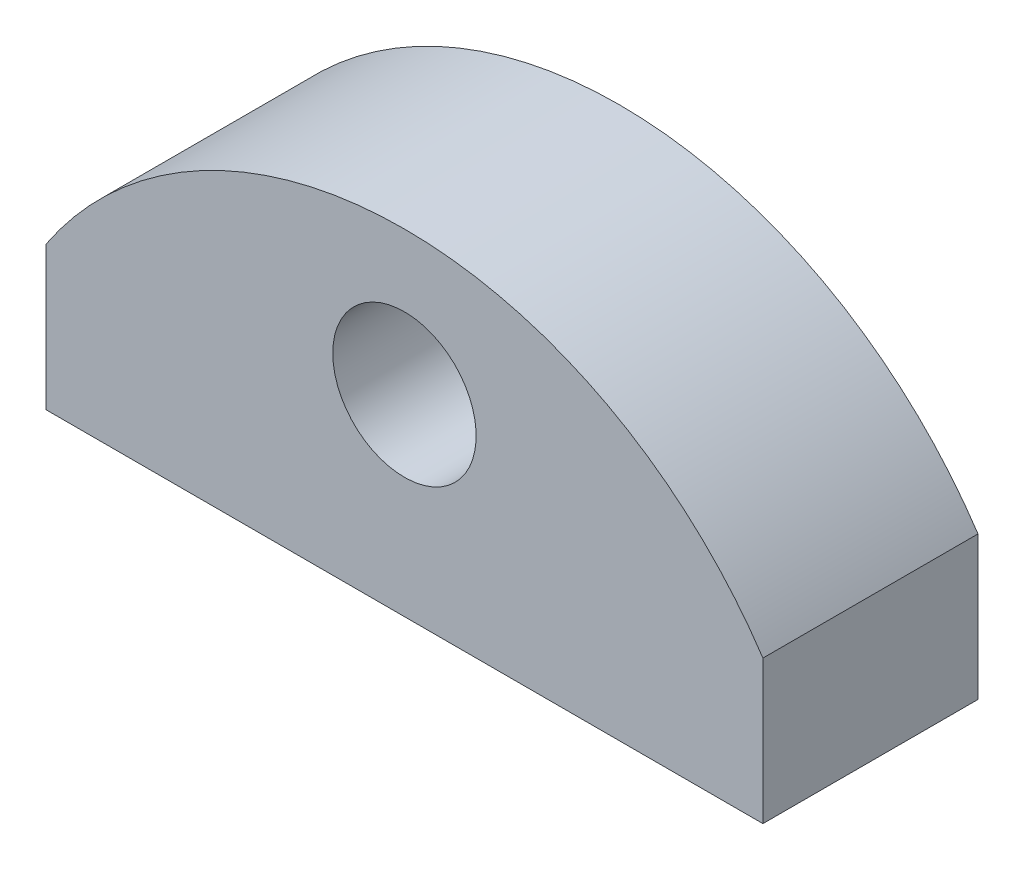
ISO-10303-21;
HEADER;
FILE_DESCRIPTION(('STEP AP214'),'2;1');
FILE_NAME('part.step','',(''),(''),'','','');
FILE_SCHEMA(('AUTOMOTIVE_DESIGN { 1 0 10303 214 1 1 1 1 }'));
ENDSEC;
DATA;
#1=APPLICATION_CONTEXT('core data for automotive mechanical design processes');
#2=APPLICATION_PROTOCOL_DEFINITION('international standard','automotive_design',2000,#1);
#3=PRODUCT_CONTEXT('',#1,'mechanical');
#4=PRODUCT('Part','Part','',(#3));
#5=PRODUCT_RELATED_PRODUCT_CATEGORY('part','',(#4));
#6=PRODUCT_DEFINITION_FORMATION('','',#4);
#7=PRODUCT_DEFINITION_CONTEXT('part definition',#1,'design');
#8=PRODUCT_DEFINITION('design','',#6,#7);
#9=PRODUCT_DEFINITION_SHAPE('','',#8);
#10=(LENGTH_UNIT() NAMED_UNIT(*) SI_UNIT(.MILLI.,.METRE.));
#11=(NAMED_UNIT(*) PLANE_ANGLE_UNIT() SI_UNIT($,.RADIAN.));
#12=(NAMED_UNIT(*) SI_UNIT($,.STERADIAN.) SOLID_ANGLE_UNIT());
#13=UNCERTAINTY_MEASURE_WITH_UNIT(LENGTH_MEASURE(1.E-05),#10,'distance_accuracy_value','');
#14=(GEOMETRIC_REPRESENTATION_CONTEXT(3) GLOBAL_UNCERTAINTY_ASSIGNED_CONTEXT((#13)) GLOBAL_UNIT_ASSIGNED_CONTEXT((#10,
#11,#12)) REPRESENTATION_CONTEXT('',''));
#15=CARTESIAN_POINT('',(0.,0.,0.));
#16=DIRECTION('',(0.,0.,1.));
#17=DIRECTION('',(1.,0.,0.));
#18=AXIS2_PLACEMENT_3D('',#15,#16,#17);
#19=CARTESIAN_POINT('',(0.,-16.583123951777,15.));
#20=DIRECTION('',(0.,0.,-1.));
#21=DIRECTION('',(-1.,0.,0.));
#22=AXIS2_PLACEMENT_3D('',#19,#20,#21);
#23=CYLINDRICAL_SURFACE('',#22,30.);
#24=CARTESIAN_POINT('',(0.,-16.583123951777,0.));
#25=DIRECTION('',(0.,0.,1.));
#26=DIRECTION('',(-1.,0.,0.));
#27=AXIS2_PLACEMENT_3D('',#24,#25,#26);
#28=CIRCLE('',#27,30.);
#29=CARTESIAN_POINT('',(25.,0.,0.));
#30=VERTEX_POINT('',#29);
#31=CARTESIAN_POINT('',(-25.,0.,0.));
#32=VERTEX_POINT('',#31);
#33=EDGE_CURVE('E100',#30,#32,#28,.T.);
#34=ORIENTED_EDGE('',*,*,#33,.T.);
#35=DIRECTION('',(0.,0.,-1.));
#36=VECTOR('',#35,1.);
#37=CARTESIAN_POINT('',(-25.,0.,15.));
#38=LINE('',#37,#36);
#39=CARTESIAN_POINT('',(-25.,0.,15.));
#40=VERTEX_POINT('',#39);
#41=EDGE_CURVE('E11',#40,#32,#38,.T.);
#42=ORIENTED_EDGE('',*,*,#41,.F.);
#43=CARTESIAN_POINT('',(0.,-16.583123951777,15.));
#44=DIRECTION('',(0.,0.,1.));
#45=DIRECTION('',(-1.,0.,0.));
#46=AXIS2_PLACEMENT_3D('',#43,#44,#45);
#47=CIRCLE('',#46,30.);
#48=CARTESIAN_POINT('',(25.,0.,15.));
#49=VERTEX_POINT('',#48);
#50=EDGE_CURVE('E88',#49,#40,#47,.T.);
#51=ORIENTED_EDGE('',*,*,#50,.F.);
#52=DIRECTION('',(0.,0.,-1.));
#53=VECTOR('',#52,1.);
#54=CARTESIAN_POINT('',(25.,0.,15.));
#55=LINE('',#54,#53);
#56=EDGE_CURVE('E96',#49,#30,#55,.T.);
#57=ORIENTED_EDGE('',*,*,#56,.T.);
#58=EDGE_LOOP('',(#34,#42,#51,#57));
#59=FACE_BOUND('',#58,.T.);
#60=ADVANCED_FACE('F37',(#59),#23,.T.);
#61=CARTESIAN_POINT('',(-25.,0.,15.));
#62=DIRECTION('',(1.,0.,0.));
#63=DIRECTION('',(0.,1.,0.));
#64=AXIS2_PLACEMENT_3D('',#61,#62,#63);
#65=PLANE('',#64);
#66=DIRECTION('',(0.,-1.,0.));
#67=VECTOR('',#66,1.);
#68=CARTESIAN_POINT('',(-25.,0.,0.));
#69=LINE('',#68,#67);
#70=CARTESIAN_POINT('',(-25.,-10.,0.));
#71=VERTEX_POINT('',#70);
#72=EDGE_CURVE('E92',#32,#71,#69,.T.);
#73=ORIENTED_EDGE('',*,*,#72,.T.);
#74=DIRECTION('',(0.,0.,-1.));
#75=VECTOR('',#74,1.);
#76=CARTESIAN_POINT('',(-25.,-10.,15.));
#77=LINE('',#76,#75);
#78=CARTESIAN_POINT('',(-25.,-10.,15.));
#79=VERTEX_POINT('',#78);
#80=EDGE_CURVE('E45',#79,#71,#77,.T.);
#81=ORIENTED_EDGE('',*,*,#80,.F.);
#82=DIRECTION('',(0.,-1.,0.));
#83=VECTOR('',#82,1.);
#84=CARTESIAN_POINT('',(-25.,0.,15.));
#85=LINE('',#84,#83);
#86=EDGE_CURVE('E83',#40,#79,#85,.T.);
#87=ORIENTED_EDGE('',*,*,#86,.F.);
#88=ORIENTED_EDGE('',*,*,#41,.T.);
#89=EDGE_LOOP('',(#73,#81,#87,#88));
#90=FACE_BOUND('',#89,.T.);
#91=ADVANCED_FACE('F91',(#90),#65,.F.);
#92=CARTESIAN_POINT('',(-25.,-10.,15.));
#93=DIRECTION('',(0.,1.,0.));
#94=DIRECTION('',(-1.,0.,0.));
#95=AXIS2_PLACEMENT_3D('',#92,#93,#94);
#96=PLANE('',#95);
#97=DIRECTION('',(1.,0.,0.));
#98=VECTOR('',#97,1.);
#99=CARTESIAN_POINT('',(-25.,-10.,0.));
#100=LINE('',#99,#98);
#101=CARTESIAN_POINT('',(25.,-9.99999999999999,0.));
#102=VERTEX_POINT('',#101);
#103=EDGE_CURVE('E70',#71,#102,#100,.T.);
#104=ORIENTED_EDGE('',*,*,#103,.T.);
#105=DIRECTION('',(0.,0.,-1.));
#106=VECTOR('',#105,1.);
#107=CARTESIAN_POINT('',(25.,-9.99999999999999,15.));
#108=LINE('',#107,#106);
#109=CARTESIAN_POINT('',(25.,-9.99999999999999,15.));
#110=VERTEX_POINT('',#109);
#111=EDGE_CURVE('E93',#110,#102,#108,.T.);
#112=ORIENTED_EDGE('',*,*,#111,.F.);
#113=DIRECTION('',(1.,0.,0.));
#114=VECTOR('',#113,1.);
#115=CARTESIAN_POINT('',(-25.,-10.,15.));
#116=LINE('',#115,#114);
#117=EDGE_CURVE('E86',#79,#110,#116,.T.);
#118=ORIENTED_EDGE('',*,*,#117,.F.);
#119=ORIENTED_EDGE('',*,*,#80,.T.);
#120=EDGE_LOOP('',(#104,#112,#118,#119));
#121=FACE_BOUND('',#120,.T.);
#122=ADVANCED_FACE('F94',(#121),#96,.F.);
#123=CARTESIAN_POINT('',(25.,-9.99999999999999,15.));
#124=DIRECTION('',(-1.,0.,0.));
#125=DIRECTION('',(0.,0.,1.));
#126=AXIS2_PLACEMENT_3D('',#123,#124,#125);
#127=PLANE('',#126);
#128=DIRECTION('',(0.,1.,0.));
#129=VECTOR('',#128,1.);
#130=CARTESIAN_POINT('',(25.,-9.99999999999999,0.));
#131=LINE('',#130,#129);
#132=EDGE_CURVE('E76',#102,#30,#131,.T.);
#133=ORIENTED_EDGE('',*,*,#132,.T.);
#134=ORIENTED_EDGE('',*,*,#56,.F.);
#135=DIRECTION('',(0.,1.,0.));
#136=VECTOR('',#135,1.);
#137=CARTESIAN_POINT('',(25.,-9.99999999999999,15.));
#138=LINE('',#137,#136);
#139=EDGE_CURVE('E53',#110,#49,#138,.T.);
#140=ORIENTED_EDGE('',*,*,#139,.F.);
#141=ORIENTED_EDGE('',*,*,#111,.T.);
#142=EDGE_LOOP('',(#133,#134,#140,#141));
#143=FACE_BOUND('',#142,.T.);
#144=ADVANCED_FACE('F108',(#143),#127,.F.);
#145=CARTESIAN_POINT('',(0.,-16.583123951777,15.));
#146=DIRECTION('',(0.,0.,-1.));
#147=DIRECTION('',(-1.,0.,0.));
#148=AXIS2_PLACEMENT_3D('',#145,#146,#147);
#149=PLANE('',#148);
#150=CARTESIAN_POINT('',(0.,3.41687604822301,15.));
#151=DIRECTION('',(0.,0.,-1.));
#152=DIRECTION('',(-1.,0.,0.));
#153=AXIS2_PLACEMENT_3D('',#150,#151,#152);
#154=CIRCLE('',#153,5.);
#155=CARTESIAN_POINT('',(-5.,3.41687604822301,15.));
#156=VERTEX_POINT('',#155);
#157=EDGE_CURVE('E103',#156,#156,#154,.F.);
#158=ORIENTED_EDGE('',*,*,#157,.F.);
#159=EDGE_LOOP('',(#158));
#160=FACE_BOUND('',#159,.T.);
#161=ORIENTED_EDGE('',*,*,#50,.T.);
#162=ORIENTED_EDGE('',*,*,#86,.T.);
#163=ORIENTED_EDGE('',*,*,#117,.T.);
#164=ORIENTED_EDGE('',*,*,#139,.T.);
#165=EDGE_LOOP('',(#161,#162,#163,#164));
#166=FACE_BOUND('',#165,.T.);
#167=ADVANCED_FACE('F84',(#160,#166),#149,.F.);
#168=CARTESIAN_POINT('',(0.,-16.583123951777,0.));
#169=DIRECTION('',(0.,0.,-1.));
#170=DIRECTION('',(-1.,0.,0.));
#171=AXIS2_PLACEMENT_3D('',#168,#169,#170);
#172=PLANE('',#171);
#173=CARTESIAN_POINT('',(0.,3.41687604822301,0.));
#174=DIRECTION('',(0.,0.,-1.));
#175=DIRECTION('',(-1.,0.,0.));
#176=AXIS2_PLACEMENT_3D('',#173,#174,#175);
#177=CIRCLE('',#176,5.);
#178=CARTESIAN_POINT('',(-5.,3.41687604822301,0.));
#179=VERTEX_POINT('',#178);
#180=EDGE_CURVE('E116',#179,#179,#177,.T.);
#181=ORIENTED_EDGE('',*,*,#180,.F.);
#182=EDGE_LOOP('',(#181));
#183=FACE_BOUND('',#182,.T.);
#184=ORIENTED_EDGE('',*,*,#33,.F.);
#185=ORIENTED_EDGE('',*,*,#132,.F.);
#186=ORIENTED_EDGE('',*,*,#103,.F.);
#187=ORIENTED_EDGE('',*,*,#72,.F.);
#188=EDGE_LOOP('',(#184,#185,#186,#187));
#189=FACE_BOUND('',#188,.T.);
#190=ADVANCED_FACE('F111',(#183,#189),#172,.T.);
#191=CARTESIAN_POINT('',(0.,3.41687604822301,15.001));
#192=DIRECTION('',(0.,0.,-1.));
#193=DIRECTION('',(-1.,0.,0.));
#194=AXIS2_PLACEMENT_3D('',#191,#192,#193);
#195=CYLINDRICAL_SURFACE('',#194,5.);
#196=CARTESIAN_POINT('',(-5.,3.41687604822301,0.));
#197=CARTESIAN_POINT('',(-5.,3.41687604822301,0.15625));
#198=CARTESIAN_POINT('',(-5.,3.41687604822301,0.3125));
#199=CARTESIAN_POINT('',(-5.,3.41687604822301,0.625000000000001));
#200=CARTESIAN_POINT('',(-5.,3.41687604822301,0.781250000000001));
#201=CARTESIAN_POINT('',(-5.,3.41687604822301,1.09375));
#202=CARTESIAN_POINT('',(-5.,3.41687604822301,1.25));
#203=CARTESIAN_POINT('',(-5.,3.41687604822301,1.5625));
#204=CARTESIAN_POINT('',(-5.,3.41687604822301,1.71875));
#205=CARTESIAN_POINT('',(-5.,3.41687604822301,2.03125));
#206=CARTESIAN_POINT('',(-5.,3.41687604822301,2.1875));
#207=CARTESIAN_POINT('',(-5.,3.41687604822301,2.5));
#208=CARTESIAN_POINT('',(-5.,3.41687604822301,2.65625));
#209=CARTESIAN_POINT('',(-5.,3.41687604822301,2.96875));
#210=CARTESIAN_POINT('',(-5.,3.41687604822301,3.125));
#211=CARTESIAN_POINT('',(-5.,3.41687604822301,3.4375));
#212=CARTESIAN_POINT('',(-5.,3.41687604822301,3.59375));
#213=CARTESIAN_POINT('',(-5.,3.41687604822301,3.90625));
#214=CARTESIAN_POINT('',(-5.,3.41687604822301,4.0625));
#215=CARTESIAN_POINT('',(-5.,3.41687604822301,4.375));
#216=CARTESIAN_POINT('',(-5.,3.41687604822301,4.53125));
#217=CARTESIAN_POINT('',(-5.,3.41687604822301,4.84375));
#218=CARTESIAN_POINT('',(-5.,3.41687604822301,5.));
#219=CARTESIAN_POINT('',(-5.,3.41687604822301,5.3125));
#220=CARTESIAN_POINT('',(-5.,3.41687604822301,5.46875));
#221=CARTESIAN_POINT('',(-5.,3.41687604822301,5.78125));
#222=CARTESIAN_POINT('',(-5.,3.41687604822301,5.9375));
#223=CARTESIAN_POINT('',(-5.,3.41687604822301,6.25));
#224=CARTESIAN_POINT('',(-5.,3.41687604822301,6.40625));
#225=CARTESIAN_POINT('',(-5.,3.41687604822301,6.71875));
#226=CARTESIAN_POINT('',(-5.,3.41687604822301,6.875));
#227=CARTESIAN_POINT('',(-5.,3.41687604822301,7.1875));
#228=CARTESIAN_POINT('',(-5.,3.41687604822301,7.34375));
#229=CARTESIAN_POINT('',(-5.,3.41687604822301,7.65625));
#230=CARTESIAN_POINT('',(-5.,3.41687604822301,7.8125));
#231=CARTESIAN_POINT('',(-5.,3.41687604822301,8.125));
#232=CARTESIAN_POINT('',(-5.,3.41687604822301,8.28125));
#233=CARTESIAN_POINT('',(-5.,3.41687604822301,8.59375));
#234=CARTESIAN_POINT('',(-5.,3.41687604822301,8.75));
#235=CARTESIAN_POINT('',(-5.,3.41687604822301,9.0625));
#236=CARTESIAN_POINT('',(-5.,3.41687604822301,9.21875));
#237=CARTESIAN_POINT('',(-5.,3.41687604822301,9.53125));
#238=CARTESIAN_POINT('',(-5.,3.41687604822301,9.6875));
#239=CARTESIAN_POINT('',(-5.,3.41687604822301,10.));
#240=CARTESIAN_POINT('',(-5.,3.41687604822301,10.15625));
#241=CARTESIAN_POINT('',(-5.,3.41687604822301,10.46875));
#242=CARTESIAN_POINT('',(-5.,3.41687604822301,10.625));
#243=CARTESIAN_POINT('',(-5.,3.41687604822301,10.9375));
#244=CARTESIAN_POINT('',(-5.,3.41687604822301,11.09375));
#245=CARTESIAN_POINT('',(-5.,3.41687604822301,11.40625));
#246=CARTESIAN_POINT('',(-5.,3.41687604822301,11.5625));
#247=CARTESIAN_POINT('',(-5.,3.41687604822301,11.875));
#248=CARTESIAN_POINT('',(-5.,3.41687604822301,12.03125));
#249=CARTESIAN_POINT('',(-5.,3.41687604822301,12.34375));
#250=CARTESIAN_POINT('',(-5.,3.41687604822301,12.5));
#251=CARTESIAN_POINT('',(-5.,3.41687604822301,12.8125));
#252=CARTESIAN_POINT('',(-5.,3.41687604822301,12.96875));
#253=CARTESIAN_POINT('',(-5.,3.41687604822301,13.28125));
#254=CARTESIAN_POINT('',(-5.,3.41687604822301,13.4375));
#255=CARTESIAN_POINT('',(-5.,3.41687604822301,13.75));
#256=CARTESIAN_POINT('',(-5.,3.41687604822301,13.90625));
#257=CARTESIAN_POINT('',(-5.,3.41687604822301,14.21875));
#258=CARTESIAN_POINT('',(-5.,3.41687604822301,14.375));
#259=CARTESIAN_POINT('',(-5.,3.41687604822301,14.6875));
#260=CARTESIAN_POINT('',(-5.,3.41687604822301,14.84375));
#261=CARTESIAN_POINT('',(-5.,3.41687604822301,15.));
#262=B_SPLINE_CURVE_WITH_KNOTS('',3,(#196,#197,#198,#199,#200,#201,#202,#203,#204,#205,#206,
#207,#208,#209,#210,#211,#212,#213,#214,#215,#216,#217,#218,#219,#220,#221,#222,#223,#224,#225,
#226,#227,#228,#229,#230,#231,#232,#233,#234,#235,#236,#237,#238,#239,#240,#241,#242,#243,#244,
#245,#246,#247,#248,#249,#250,#251,#252,#253,#254,#255,#256,#257,#258,#259,#260,#261),
.UNSPECIFIED.,.F.,.F.,(4,2,2,2,2,2,2,2,2,2,2,2,2,2,2,2,2,2,2,2,2,2,2,2,2,2,2,2,2,2,2,2,4),(0.,
0.46875,0.937500000000001,1.40625,1.875,2.34375,2.8125,3.28125,3.75,4.21875,4.6875,5.15625,
5.625,6.09375,6.5625,7.03125,7.5,7.96875,8.4375,8.90625,9.375,9.84375,10.3125,10.78125,11.25,
11.71875,12.1875,12.65625,13.125,13.59375,14.0625,14.53125,15.),.UNSPECIFIED.);
#263=EDGE_CURVE('BSEAM120',#179,#156,#262,.T.);
#264=ORIENTED_EDGE('',*,*,#180,.T.);
#265=ORIENTED_EDGE('',*,*,#157,.T.);
#266=ORIENTED_EDGE('',*,*,#263,.T.);
#267=ORIENTED_EDGE('',*,*,#263,.F.);
#268=EDGE_LOOP('',(#264,#266,#265,#267));
#269=FACE_BOUND('',#268,.T.);
#270=ADVANCED_FACE('F120',(#269),#195,.F.);
#271=CLOSED_SHELL('',(#60,#91,#122,#144,#167,#190,#270));
#272=MANIFOLD_SOLID_BREP('B2',#271);
#273=ADVANCED_BREP_SHAPE_REPRESENTATION('',(#18,#272),#14);
#274=SHAPE_DEFINITION_REPRESENTATION(#9,#273);
ENDSEC;
END-ISO-10303-21;
